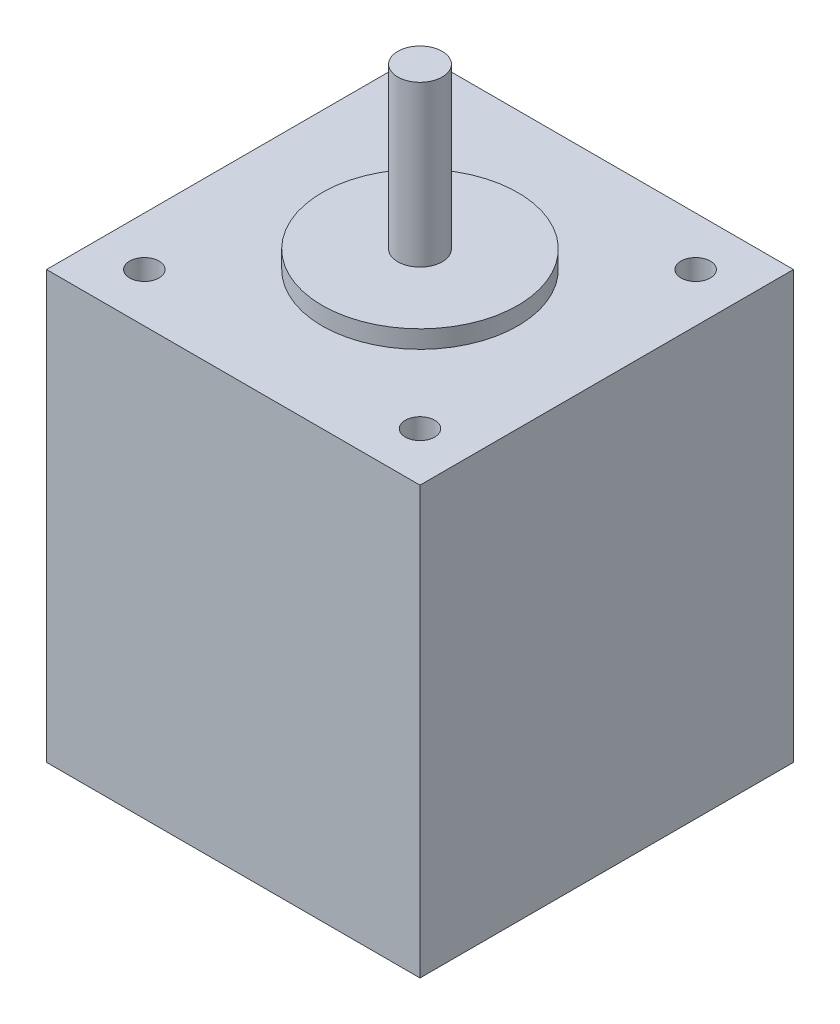
ISO-10303-21;
HEADER;
FILE_DESCRIPTION(('STEP AP214'),'2;1');
FILE_NAME('part.step','',(''),(''),'','','');
FILE_SCHEMA(('AUTOMOTIVE_DESIGN { 1 0 10303 214 1 1 1 1 }'));
ENDSEC;
DATA;
#1=APPLICATION_CONTEXT('core data for automotive mechanical design processes');
#2=APPLICATION_PROTOCOL_DEFINITION('international standard','automotive_design',2000,#1);
#3=PRODUCT_CONTEXT('',#1,'mechanical');
#4=PRODUCT('Part','Part','',(#3));
#5=PRODUCT_RELATED_PRODUCT_CATEGORY('part','',(#4));
#6=PRODUCT_DEFINITION_FORMATION('','',#4);
#7=PRODUCT_DEFINITION_CONTEXT('part definition',#1,'design');
#8=PRODUCT_DEFINITION('design','',#6,#7);
#9=PRODUCT_DEFINITION_SHAPE('','',#8);
#10=(LENGTH_UNIT() NAMED_UNIT(*) SI_UNIT(.MILLI.,.METRE.));
#11=(NAMED_UNIT(*) PLANE_ANGLE_UNIT() SI_UNIT($,.RADIAN.));
#12=(NAMED_UNIT(*) SI_UNIT($,.STERADIAN.) SOLID_ANGLE_UNIT());
#13=UNCERTAINTY_MEASURE_WITH_UNIT(LENGTH_MEASURE(1.E-05),#10,'distance_accuracy_value','');
#14=(GEOMETRIC_REPRESENTATION_CONTEXT(3) GLOBAL_UNCERTAINTY_ASSIGNED_CONTEXT((#13)) GLOBAL_UNIT_ASSIGNED_CONTEXT((#10,
#11,#12)) REPRESENTATION_CONTEXT('',''));
#15=CARTESIAN_POINT('',(0.,0.,0.));
#16=DIRECTION('',(0.,0.,1.));
#17=DIRECTION('',(1.,0.,0.));
#18=AXIS2_PLACEMENT_3D('',#15,#16,#17);
#19=CARTESIAN_POINT('',(-21.,48.,21.));
#20=DIRECTION('',(1.,0.,0.));
#21=DIRECTION('',(0.,0.,-1.));
#22=AXIS2_PLACEMENT_3D('',#19,#20,#21);
#23=PLANE('',#22);
#24=DIRECTION('',(0.,0.,1.));
#25=VECTOR('',#24,1.);
#26=CARTESIAN_POINT('',(-21.,0.,21.));
#27=LINE('',#26,#25);
#28=CARTESIAN_POINT('',(-21.,0.,-21.));
#29=VERTEX_POINT('',#28);
#30=CARTESIAN_POINT('',(-21.,0.,21.));
#31=VERTEX_POINT('',#30);
#32=EDGE_CURVE('E100',#29,#31,#27,.T.);
#33=ORIENTED_EDGE('',*,*,#32,.T.);
#34=DIRECTION('',(0.,-1.,0.));
#35=VECTOR('',#34,1.);
#36=CARTESIAN_POINT('',(-21.,48.,21.));
#37=LINE('',#36,#35);
#38=CARTESIAN_POINT('',(-21.,48.,21.));
#39=VERTEX_POINT('',#38);
#40=EDGE_CURVE('E11',#39,#31,#37,.T.);
#41=ORIENTED_EDGE('',*,*,#40,.F.);
#42=DIRECTION('',(0.,0.,1.));
#43=VECTOR('',#42,1.);
#44=CARTESIAN_POINT('',(-21.,48.,21.));
#45=LINE('',#44,#43);
#46=CARTESIAN_POINT('',(-21.,48.,-21.));
#47=VERTEX_POINT('',#46);
#48=EDGE_CURVE('E87',#47,#39,#45,.T.);
#49=ORIENTED_EDGE('',*,*,#48,.F.);
#50=DIRECTION('',(0.,-1.,0.));
#51=VECTOR('',#50,1.);
#52=CARTESIAN_POINT('',(-21.,48.,-21.));
#53=LINE('',#52,#51);
#54=EDGE_CURVE('E96',#47,#29,#53,.T.);
#55=ORIENTED_EDGE('',*,*,#54,.T.);
#56=EDGE_LOOP('',(#33,#41,#49,#55));
#57=FACE_BOUND('',#56,.T.);
#58=ADVANCED_FACE('F35',(#57),#23,.F.);
#59=CARTESIAN_POINT('',(21.,48.,21.));
#60=DIRECTION('',(0.,0.,-1.));
#61=DIRECTION('',(-1.,0.,0.));
#62=AXIS2_PLACEMENT_3D('',#59,#60,#61);
#63=PLANE('',#62);
#64=DIRECTION('',(1.,0.,0.));
#65=VECTOR('',#64,1.);
#66=CARTESIAN_POINT('',(21.,0.,21.));
#67=LINE('',#66,#65);
#68=CARTESIAN_POINT('',(21.,0.,21.));
#69=VERTEX_POINT('',#68);
#70=EDGE_CURVE('E91',#31,#69,#67,.T.);
#71=ORIENTED_EDGE('',*,*,#70,.T.);
#72=DIRECTION('',(0.,-1.,0.));
#73=VECTOR('',#72,1.);
#74=CARTESIAN_POINT('',(21.,48.,21.));
#75=LINE('',#74,#73);
#76=CARTESIAN_POINT('',(21.,48.,21.));
#77=VERTEX_POINT('',#76);
#78=EDGE_CURVE('E44',#77,#69,#75,.T.);
#79=ORIENTED_EDGE('',*,*,#78,.F.);
#80=DIRECTION('',(1.,0.,0.));
#81=VECTOR('',#80,1.);
#82=CARTESIAN_POINT('',(21.,48.,21.));
#83=LINE('',#82,#81);
#84=EDGE_CURVE('E82',#39,#77,#83,.T.);
#85=ORIENTED_EDGE('',*,*,#84,.F.);
#86=ORIENTED_EDGE('',*,*,#40,.T.);
#87=EDGE_LOOP('',(#71,#79,#85,#86));
#88=FACE_BOUND('',#87,.T.);
#89=ADVANCED_FACE('F90',(#88),#63,.F.);
#90=CARTESIAN_POINT('',(21.,48.,21.));
#91=DIRECTION('',(-1.,0.,0.));
#92=DIRECTION('',(0.,0.,1.));
#93=AXIS2_PLACEMENT_3D('',#90,#91,#92);
#94=PLANE('',#93);
#95=DIRECTION('',(0.,0.,-1.));
#96=VECTOR('',#95,1.);
#97=CARTESIAN_POINT('',(21.,0.,21.));
#98=LINE('',#97,#96);
#99=CARTESIAN_POINT('',(21.,0.,-21.));
#100=VERTEX_POINT('',#99);
#101=EDGE_CURVE('E69',#69,#100,#98,.T.);
#102=ORIENTED_EDGE('',*,*,#101,.T.);
#103=DIRECTION('',(0.,-1.,0.));
#104=VECTOR('',#103,1.);
#105=CARTESIAN_POINT('',(21.,48.,-21.));
#106=LINE('',#105,#104);
#107=CARTESIAN_POINT('',(21.,48.,-21.));
#108=VERTEX_POINT('',#107);
#109=EDGE_CURVE('E92',#108,#100,#106,.T.);
#110=ORIENTED_EDGE('',*,*,#109,.F.);
#111=DIRECTION('',(0.,0.,-1.));
#112=VECTOR('',#111,1.);
#113=CARTESIAN_POINT('',(21.,48.,21.));
#114=LINE('',#113,#112);
#115=EDGE_CURVE('E85',#77,#108,#114,.T.);
#116=ORIENTED_EDGE('',*,*,#115,.F.);
#117=ORIENTED_EDGE('',*,*,#78,.T.);
#118=EDGE_LOOP('',(#102,#110,#116,#117));
#119=FACE_BOUND('',#118,.T.);
#120=ADVANCED_FACE('F94',(#119),#94,.F.);
#121=CARTESIAN_POINT('',(21.,48.,-21.));
#122=DIRECTION('',(0.,0.,1.));
#123=DIRECTION('',(1.,0.,0.));
#124=AXIS2_PLACEMENT_3D('',#121,#122,#123);
#125=PLANE('',#124);
#126=DIRECTION('',(-1.,0.,0.));
#127=VECTOR('',#126,1.);
#128=CARTESIAN_POINT('',(21.,0.,-21.));
#129=LINE('',#128,#127);
#130=EDGE_CURVE('E75',#100,#29,#129,.T.);
#131=ORIENTED_EDGE('',*,*,#130,.T.);
#132=ORIENTED_EDGE('',*,*,#54,.F.);
#133=DIRECTION('',(-1.,0.,0.));
#134=VECTOR('',#133,1.);
#135=CARTESIAN_POINT('',(21.,48.,-21.));
#136=LINE('',#135,#134);
#137=EDGE_CURVE('E52',#108,#47,#136,.T.);
#138=ORIENTED_EDGE('',*,*,#137,.F.);
#139=ORIENTED_EDGE('',*,*,#109,.T.);
#140=EDGE_LOOP('',(#131,#132,#138,#139));
#141=FACE_BOUND('',#140,.T.);
#142=ADVANCED_FACE('F108',(#141),#125,.F.);
#143=CARTESIAN_POINT('',(0.,48.,0.));
#144=DIRECTION('',(0.,1.,0.));
#145=DIRECTION('',(0.,0.,1.));
#146=AXIS2_PLACEMENT_3D('',#143,#144,#145);
#147=PLANE('',#146);
#148=CARTESIAN_POINT('',(0.,48.,0.));
#149=DIRECTION('',(0.,1.,0.));
#150=DIRECTION('',(0.,0.,1.));
#151=AXIS2_PLACEMENT_3D('',#148,#149,#150);
#152=CIRCLE('',#151,11.);
#153=CARTESIAN_POINT('',(0.,48.,11.));
#154=VERTEX_POINT('',#153);
#155=EDGE_CURVE('E146',#154,#154,#152,.T.);
#156=ORIENTED_EDGE('',*,*,#155,.F.);
#157=EDGE_LOOP('',(#156));
#158=FACE_BOUND('',#157,.T.);
#159=CARTESIAN_POINT('',(-15.5,48.,-15.5));
#160=DIRECTION('',(0.,1.,0.));
#161=DIRECTION('',(0.,0.,1.));
#162=AXIS2_PLACEMENT_3D('',#159,#160,#161);
#163=CIRCLE('',#162,1.65);
#164=CARTESIAN_POINT('',(-15.5,48.,-13.85));
#165=VERTEX_POINT('',#164);
#166=EDGE_CURVE('E143',#165,#165,#163,.T.);
#167=ORIENTED_EDGE('',*,*,#166,.F.);
#168=EDGE_LOOP('',(#167));
#169=FACE_BOUND('',#168,.T.);
#170=CARTESIAN_POINT('',(-15.5,48.,15.5));
#171=DIRECTION('',(0.,1.,0.));
#172=DIRECTION('',(0.,0.,1.));
#173=AXIS2_PLACEMENT_3D('',#170,#171,#172);
#174=CIRCLE('',#173,1.65);
#175=CARTESIAN_POINT('',(-15.5,48.,17.15));
#176=VERTEX_POINT('',#175);
#177=EDGE_CURVE('E137',#176,#176,#174,.T.);
#178=ORIENTED_EDGE('',*,*,#177,.F.);
#179=EDGE_LOOP('',(#178));
#180=FACE_BOUND('',#179,.T.);
#181=CARTESIAN_POINT('',(15.5,48.,15.5));
#182=DIRECTION('',(0.,1.,0.));
#183=DIRECTION('',(0.,0.,1.));
#184=AXIS2_PLACEMENT_3D('',#181,#182,#183);
#185=CIRCLE('',#184,1.64999999999999);
#186=CARTESIAN_POINT('',(15.5,48.,17.15));
#187=VERTEX_POINT('',#186);
#188=EDGE_CURVE('E131',#187,#187,#185,.T.);
#189=ORIENTED_EDGE('',*,*,#188,.F.);
#190=EDGE_LOOP('',(#189));
#191=FACE_BOUND('',#190,.T.);
#192=CARTESIAN_POINT('',(15.5,48.,-15.5));
#193=DIRECTION('',(0.,1.,0.));
#194=DIRECTION('',(0.,0.,1.));
#195=AXIS2_PLACEMENT_3D('',#192,#193,#194);
#196=CIRCLE('',#195,1.64999999999999);
#197=CARTESIAN_POINT('',(15.5,48.,-13.85));
#198=VERTEX_POINT('',#197);
#199=EDGE_CURVE('E125',#198,#198,#196,.T.);
#200=ORIENTED_EDGE('',*,*,#199,.F.);
#201=EDGE_LOOP('',(#200));
#202=FACE_BOUND('',#201,.T.);
#203=ORIENTED_EDGE('',*,*,#48,.T.);
#204=ORIENTED_EDGE('',*,*,#84,.T.);
#205=ORIENTED_EDGE('',*,*,#115,.T.);
#206=ORIENTED_EDGE('',*,*,#137,.T.);
#207=EDGE_LOOP('',(#203,#204,#205,#206));
#208=FACE_BOUND('',#207,.T.);
#209=ADVANCED_FACE('F83',(#158,#169,#180,#191,#202,#208),#147,.T.);
#210=CARTESIAN_POINT('',(0.,0.,0.));
#211=DIRECTION('',(0.,1.,0.));
#212=DIRECTION('',(0.,0.,1.));
#213=AXIS2_PLACEMENT_3D('',#210,#211,#212);
#214=PLANE('',#213);
#215=CARTESIAN_POINT('',(-15.5,0.,-15.5));
#216=DIRECTION('',(0.,1.,0.));
#217=DIRECTION('',(0.,0.,1.));
#218=AXIS2_PLACEMENT_3D('',#215,#216,#217);
#219=CIRCLE('',#218,1.64999999999999);
#220=CARTESIAN_POINT('',(-15.5,0.,-13.85));
#221=VERTEX_POINT('',#220);
#222=EDGE_CURVE('E140',#221,#221,#219,.T.);
#223=ORIENTED_EDGE('',*,*,#222,.T.);
#224=EDGE_LOOP('',(#223));
#225=FACE_BOUND('',#224,.T.);
#226=CARTESIAN_POINT('',(-15.5,0.,15.5));
#227=DIRECTION('',(0.,1.,0.));
#228=DIRECTION('',(0.,0.,1.));
#229=AXIS2_PLACEMENT_3D('',#226,#227,#228);
#230=CIRCLE('',#229,1.64999999999999);
#231=CARTESIAN_POINT('',(-15.5,0.,17.15));
#232=VERTEX_POINT('',#231);
#233=EDGE_CURVE('E134',#232,#232,#230,.T.);
#234=ORIENTED_EDGE('',*,*,#233,.T.);
#235=EDGE_LOOP('',(#234));
#236=FACE_BOUND('',#235,.T.);
#237=CARTESIAN_POINT('',(15.5,0.,15.5));
#238=DIRECTION('',(0.,1.,0.));
#239=DIRECTION('',(0.,0.,1.));
#240=AXIS2_PLACEMENT_3D('',#237,#238,#239);
#241=CIRCLE('',#240,1.64999999999999);
#242=CARTESIAN_POINT('',(15.5,0.,17.15));
#243=VERTEX_POINT('',#242);
#244=EDGE_CURVE('E128',#243,#243,#241,.T.);
#245=ORIENTED_EDGE('',*,*,#244,.T.);
#246=EDGE_LOOP('',(#245));
#247=FACE_BOUND('',#246,.T.);
#248=CARTESIAN_POINT('',(15.5,0.,-15.5));
#249=DIRECTION('',(0.,1.,0.));
#250=DIRECTION('',(0.,0.,1.));
#251=AXIS2_PLACEMENT_3D('',#248,#249,#250);
#252=CIRCLE('',#251,1.64999999999999);
#253=CARTESIAN_POINT('',(15.5,0.,-13.85));
#254=VERTEX_POINT('',#253);
#255=EDGE_CURVE('E122',#254,#254,#252,.T.);
#256=ORIENTED_EDGE('',*,*,#255,.T.);
#257=EDGE_LOOP('',(#256));
#258=FACE_BOUND('',#257,.T.);
#259=CARTESIAN_POINT('',(0.,0.,0.));
#260=DIRECTION('',(0.,1.,0.));
#261=DIRECTION('',(0.,0.,1.));
#262=AXIS2_PLACEMENT_3D('',#259,#260,#261);
#263=CIRCLE('',#262,1.64999999999999);
#264=CARTESIAN_POINT('',(0.,0.,1.64999999999999));
#265=VERTEX_POINT('',#264);
#266=EDGE_CURVE('E116',#265,#265,#263,.T.);
#267=ORIENTED_EDGE('',*,*,#266,.T.);
#268=EDGE_LOOP('',(#267));
#269=FACE_BOUND('',#268,.T.);
#270=ORIENTED_EDGE('',*,*,#32,.F.);
#271=ORIENTED_EDGE('',*,*,#130,.F.);
#272=ORIENTED_EDGE('',*,*,#101,.F.);
#273=ORIENTED_EDGE('',*,*,#70,.F.);
#274=EDGE_LOOP('',(#270,#271,#272,#273));
#275=FACE_BOUND('',#274,.T.);
#276=ADVANCED_FACE('F111',(#225,#236,#247,#258,#269,#275),#214,.F.);
#277=CARTESIAN_POINT('',(1.64999999999999,48.,0.));
#278=DIRECTION('',(0.,1.,0.));
#279=DIRECTION('',(0.,0.,1.));
#280=AXIS2_PLACEMENT_3D('',#277,#278,#279);
#281=PLANE('',#280);
#282=CARTESIAN_POINT('',(0.,48.,0.));
#283=DIRECTION('',(0.,1.,0.));
#284=DIRECTION('',(0.,0.,1.));
#285=AXIS2_PLACEMENT_3D('',#282,#283,#284);
#286=CIRCLE('',#285,1.64999999999999);
#287=CARTESIAN_POINT('',(0.,48.,1.64999999999999));
#288=VERTEX_POINT('',#287);
#289=EDGE_CURVE('E119',#288,#288,#286,.T.);
#290=ORIENTED_EDGE('',*,*,#289,.F.);
#291=EDGE_LOOP('',(#290));
#292=FACE_BOUND('',#291,.T.);
#293=ADVANCED_FACE('F186',(#292),#281,.F.);
#294=CARTESIAN_POINT('',(0.,48.,0.));
#295=DIRECTION('',(0.,1.,0.));
#296=DIRECTION('',(0.,0.,1.));
#297=AXIS2_PLACEMENT_3D('',#294,#295,#296);
#298=CYLINDRICAL_SURFACE('',#297,1.64999999999999);
#299=ORIENTED_EDGE('',*,*,#266,.F.);
#300=EDGE_LOOP('',(#299));
#301=FACE_BOUND('',#300,.T.);
#302=ORIENTED_EDGE('',*,*,#289,.T.);
#303=EDGE_LOOP('',(#302));
#304=FACE_BOUND('',#303,.T.);
#305=ADVANCED_FACE('F195',(#301,#304),#298,.F.);
#306=CARTESIAN_POINT('',(15.5,48.,-15.5));
#307=DIRECTION('',(0.,1.,0.));
#308=DIRECTION('',(0.,0.,1.));
#309=AXIS2_PLACEMENT_3D('',#306,#307,#308);
#310=CYLINDRICAL_SURFACE('',#309,1.64999999999999);
#311=ORIENTED_EDGE('',*,*,#255,.F.);
#312=EDGE_LOOP('',(#311));
#313=FACE_BOUND('',#312,.T.);
#314=ORIENTED_EDGE('',*,*,#199,.T.);
#315=EDGE_LOOP('',(#314));
#316=FACE_BOUND('',#315,.T.);
#317=ADVANCED_FACE('F199',(#313,#316),#310,.F.);
#318=CARTESIAN_POINT('',(15.5,48.,15.5));
#319=DIRECTION('',(0.,1.,0.));
#320=DIRECTION('',(0.,0.,1.));
#321=AXIS2_PLACEMENT_3D('',#318,#319,#320);
#322=CYLINDRICAL_SURFACE('',#321,1.64999999999999);
#323=ORIENTED_EDGE('',*,*,#244,.F.);
#324=EDGE_LOOP('',(#323));
#325=FACE_BOUND('',#324,.T.);
#326=ORIENTED_EDGE('',*,*,#188,.T.);
#327=EDGE_LOOP('',(#326));
#328=FACE_BOUND('',#327,.T.);
#329=ADVANCED_FACE('F203',(#325,#328),#322,.F.);
#330=CARTESIAN_POINT('',(-15.5,48.,15.5));
#331=DIRECTION('',(0.,1.,0.));
#332=DIRECTION('',(0.,0.,1.));
#333=AXIS2_PLACEMENT_3D('',#330,#331,#332);
#334=CYLINDRICAL_SURFACE('',#333,1.64999999999999);
#335=ORIENTED_EDGE('',*,*,#233,.F.);
#336=EDGE_LOOP('',(#335));
#337=FACE_BOUND('',#336,.T.);
#338=ORIENTED_EDGE('',*,*,#177,.T.);
#339=EDGE_LOOP('',(#338));
#340=FACE_BOUND('',#339,.T.);
#341=ADVANCED_FACE('F207',(#337,#340),#334,.F.);
#342=CARTESIAN_POINT('',(-15.5,48.,-15.5));
#343=DIRECTION('',(0.,1.,0.));
#344=DIRECTION('',(0.,0.,1.));
#345=AXIS2_PLACEMENT_3D('',#342,#343,#344);
#346=CYLINDRICAL_SURFACE('',#345,1.64999999999999);
#347=ORIENTED_EDGE('',*,*,#222,.F.);
#348=EDGE_LOOP('',(#347));
#349=FACE_BOUND('',#348,.T.);
#350=ORIENTED_EDGE('',*,*,#166,.T.);
#351=EDGE_LOOP('',(#350));
#352=FACE_BOUND('',#351,.T.);
#353=ADVANCED_FACE('F170',(#349,#352),#346,.F.);
#354=CARTESIAN_POINT('',(0.,50.,0.));
#355=DIRECTION('',(0.,-1.,0.));
#356=DIRECTION('',(0.,0.,-1.));
#357=AXIS2_PLACEMENT_3D('',#354,#355,#356);
#358=CYLINDRICAL_SURFACE('',#357,11.);
#359=CARTESIAN_POINT('',(0.,50.,0.));
#360=DIRECTION('',(0.,1.,0.));
#361=DIRECTION('',(0.,0.,1.));
#362=AXIS2_PLACEMENT_3D('',#359,#360,#361);
#363=CIRCLE('',#362,11.);
#364=CARTESIAN_POINT('',(0.,50.,11.));
#365=VERTEX_POINT('',#364);
#366=EDGE_CURVE('E149',#365,#365,#363,.T.);
#367=ORIENTED_EDGE('',*,*,#366,.F.);
#368=EDGE_LOOP('',(#367));
#369=FACE_BOUND('',#368,.T.);
#370=ORIENTED_EDGE('',*,*,#155,.T.);
#371=EDGE_LOOP('',(#370));
#372=FACE_BOUND('',#371,.T.);
#373=ADVANCED_FACE('F162',(#369,#372),#358,.T.);
#374=CARTESIAN_POINT('',(0.,50.,0.));
#375=DIRECTION('',(0.,1.,0.));
#376=DIRECTION('',(0.,0.,1.));
#377=AXIS2_PLACEMENT_3D('',#374,#375,#376);
#378=PLANE('',#377);
#379=CARTESIAN_POINT('',(0.,50.,0.));
#380=DIRECTION('',(0.,1.,0.));
#381=DIRECTION('',(0.,0.,1.));
#382=AXIS2_PLACEMENT_3D('',#379,#380,#381);
#383=CIRCLE('',#382,2.5);
#384=CARTESIAN_POINT('',(0.,50.,2.5));
#385=VERTEX_POINT('',#384);
#386=EDGE_CURVE('E38',#385,#385,#383,.T.);
#387=ORIENTED_EDGE('',*,*,#386,.F.);
#388=EDGE_LOOP('',(#387));
#389=FACE_BOUND('',#388,.T.);
#390=ORIENTED_EDGE('',*,*,#366,.T.);
#391=EDGE_LOOP('',(#390));
#392=FACE_BOUND('',#391,.T.);
#393=ADVANCED_FACE('F159',(#389,#392),#378,.T.);
#394=CARTESIAN_POINT('',(0.,68.,0.));
#395=DIRECTION('',(0.,1.,0.));
#396=DIRECTION('',(0.,0.,1.));
#397=AXIS2_PLACEMENT_3D('',#394,#395,#396);
#398=PLANE('',#397);
#399=CARTESIAN_POINT('',(0.,68.,0.));
#400=DIRECTION('',(0.,1.,0.));
#401=DIRECTION('',(0.,0.,1.));
#402=AXIS2_PLACEMENT_3D('',#399,#400,#401);
#403=CIRCLE('',#402,2.5);
#404=CARTESIAN_POINT('',(0.,68.,2.5));
#405=VERTEX_POINT('',#404);
#406=EDGE_CURVE('E103',#405,#405,#403,.T.);
#407=ORIENTED_EDGE('',*,*,#406,.T.);
#408=EDGE_LOOP('',(#407));
#409=FACE_BOUND('',#408,.T.);
#410=ADVANCED_FACE('F161',(#409),#398,.T.);
#411=CARTESIAN_POINT('',(0.,68.,0.));
#412=DIRECTION('',(0.,-1.,0.));
#413=DIRECTION('',(0.,0.,-1.));
#414=AXIS2_PLACEMENT_3D('',#411,#412,#413);
#415=CYLINDRICAL_SURFACE('',#414,2.5);
#416=ORIENTED_EDGE('',*,*,#386,.T.);
#417=EDGE_LOOP('',(#416));
#418=FACE_BOUND('',#417,.T.);
#419=ORIENTED_EDGE('',*,*,#406,.F.);
#420=EDGE_LOOP('',(#419));
#421=FACE_BOUND('',#420,.T.);
#422=ADVANCED_FACE('F156',(#418,#421),#415,.T.);
#423=CLOSED_SHELL('',(#58,#89,#120,#142,#209,#276,#293,#305,#317,#329,#341,#353,#373,#393,#410,#422));
#424=MANIFOLD_SOLID_BREP('B2',#423);
#425=ADVANCED_BREP_SHAPE_REPRESENTATION('',(#18,#424),#14);
#426=SHAPE_DEFINITION_REPRESENTATION(#9,#425);
ENDSEC;
END-ISO-10303-21;
